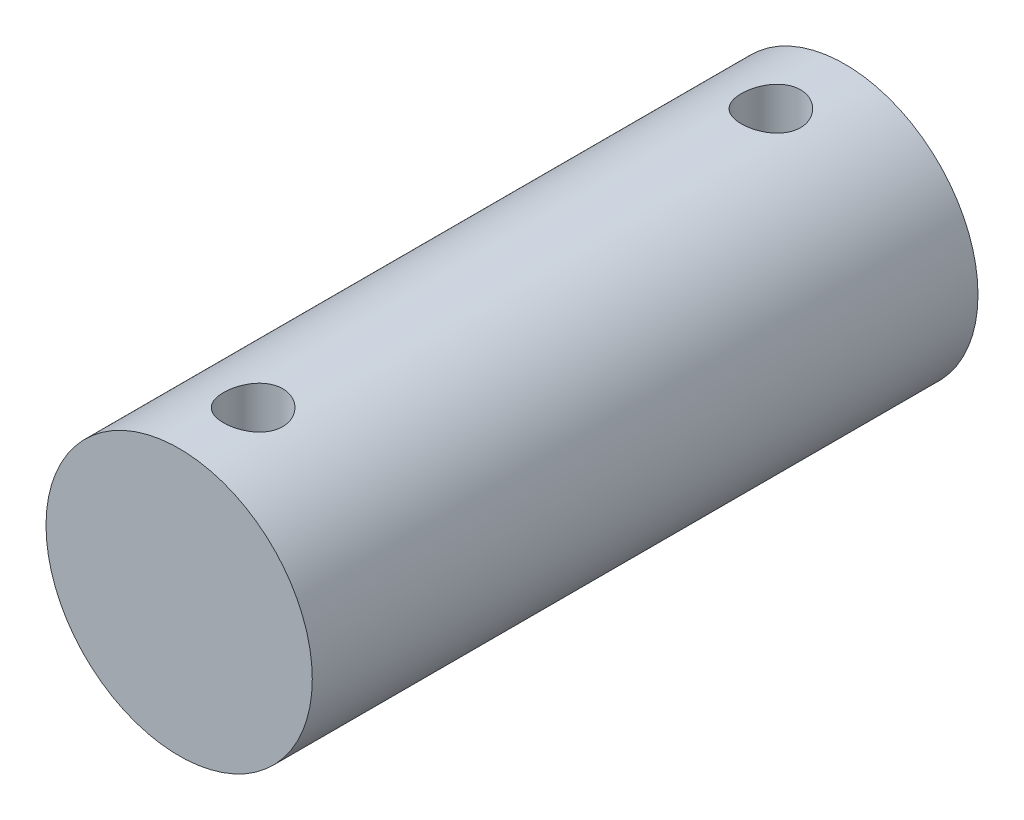
ISO-10303-21;
HEADER;
FILE_DESCRIPTION(('STEP AP214'),'2;1');
FILE_NAME('part.step','',(''),(''),'','','');
FILE_SCHEMA(('AUTOMOTIVE_DESIGN { 1 0 10303 214 1 1 1 1 }'));
ENDSEC;
DATA;
#1=APPLICATION_CONTEXT('core data for automotive mechanical design processes');
#2=APPLICATION_PROTOCOL_DEFINITION('international standard','automotive_design',2000,#1);
#3=PRODUCT_CONTEXT('',#1,'mechanical');
#4=PRODUCT('Part','Part','',(#3));
#5=PRODUCT_RELATED_PRODUCT_CATEGORY('part','',(#4));
#6=PRODUCT_DEFINITION_FORMATION('','',#4);
#7=PRODUCT_DEFINITION_CONTEXT('part definition',#1,'design');
#8=PRODUCT_DEFINITION('design','',#6,#7);
#9=PRODUCT_DEFINITION_SHAPE('','',#8);
#10=(LENGTH_UNIT() NAMED_UNIT(*) SI_UNIT(.MILLI.,.METRE.));
#11=(NAMED_UNIT(*) PLANE_ANGLE_UNIT() SI_UNIT($,.RADIAN.));
#12=(NAMED_UNIT(*) SI_UNIT($,.STERADIAN.) SOLID_ANGLE_UNIT());
#13=UNCERTAINTY_MEASURE_WITH_UNIT(LENGTH_MEASURE(1.E-05),#10,'distance_accuracy_value','');
#14=(GEOMETRIC_REPRESENTATION_CONTEXT(3) GLOBAL_UNCERTAINTY_ASSIGNED_CONTEXT((#13)) GLOBAL_UNIT_ASSIGNED_CONTEXT((#10,
#11,#12)) REPRESENTATION_CONTEXT('',''));
#15=CARTESIAN_POINT('',(0.,0.,0.));
#16=DIRECTION('',(0.,0.,1.));
#17=DIRECTION('',(1.,0.,0.));
#18=AXIS2_PLACEMENT_3D('',#15,#16,#17);
#19=CARTESIAN_POINT('',(0.,0.,12.5));
#20=DIRECTION('',(0.,0.,-1.));
#21=DIRECTION('',(-1.,0.,0.));
#22=AXIS2_PLACEMENT_3D('',#19,#20,#21);
#23=CYLINDRICAL_SURFACE('',#22,9.);
#24=CARTESIAN_POINT('',(0.,-9.,19.5));
#25=CARTESIAN_POINT('',(0.110880476775648,-8.99999796218252,19.4999962763202));
#26=CARTESIAN_POINT('',(0.22180556526962,-8.99793013995692,19.4907480183365));
#27=CARTESIAN_POINT('',(0.440501944103134,-8.9898809775767,19.4540395276494));
#28=CARTESIAN_POINT('',(0.548270975138988,-8.98389690217348,19.4265665659907));
#29=CARTESIAN_POINT('',(0.757463277761529,-8.96868113169008,19.3543140295083));
#30=CARTESIAN_POINT('',(0.858893152100285,-8.95945288439083,19.3095528230021));
#31=CARTESIAN_POINT('',(1.05280018031376,-8.93874335441378,19.2040533875276));
#32=CARTESIAN_POINT('',(1.14527750793335,-8.92726211547358,19.1433154687094));
#33=CARTESIAN_POINT('',(1.32018631401403,-8.9030909417421,19.0065243348933));
#34=CARTESIAN_POINT('',(1.40244861204354,-8.89038561641427,18.9302574978649));
#35=CARTESIAN_POINT('',(1.55312491045837,-8.86530601079787,18.7650319399069));
#36=CARTESIAN_POINT('',(1.62153764410855,-8.85293176088049,18.6760720592895));
#37=CARTESIAN_POINT('',(1.74332443410351,-8.82976328261711,18.4867281559417));
#38=CARTESIAN_POINT('',(1.79651742104404,-8.81898875742981,18.3862250419585));
#39=CARTESIAN_POINT('',(1.88519298954508,-8.80046096352395,18.1774272383076));
#40=CARTESIAN_POINT('',(1.92067776220096,-8.79270732104771,18.0691335144957));
#41=CARTESIAN_POINT('',(1.97236858006404,-8.78125609459189,17.8496665226773));
#42=CARTESIAN_POINT('',(1.98887467038069,-8.77749545807783,17.7385672848946));
#43=CARTESIAN_POINT('',(2.00307270997673,-8.77426673730669,17.5151177822138));
#44=CARTESIAN_POINT('',(2.00076704911663,-8.77479810778939,17.4027676780379));
#45=CARTESIAN_POINT('',(1.97764827517302,-8.78003632148146,17.1822433728062));
#46=CARTESIAN_POINT('',(1.95718464460217,-8.78466431384841,17.0740303758606));
#47=CARTESIAN_POINT('',(1.89888490681146,-8.79744954191676,16.862612856675));
#48=CARTESIAN_POINT('',(1.86104779681652,-8.80560698133176,16.7594086239146));
#49=CARTESIAN_POINT('',(1.76875672872875,-8.82460909970296,16.5599605616181));
#50=CARTESIAN_POINT('',(1.71416919379353,-8.8354752436249,16.4637806726639));
#51=CARTESIAN_POINT('',(1.59002068139849,-8.85865737910744,16.2818171294841));
#52=CARTESIAN_POINT('',(1.52045760074274,-8.87097357420597,16.1960349381798));
#53=CARTESIAN_POINT('',(1.36648683702983,-8.89600574612666,16.0352906906515));
#54=CARTESIAN_POINT('',(1.28178220526623,-8.90872450687872,15.9606132148949));
#55=CARTESIAN_POINT('',(1.10090661809162,-8.93287839122317,15.8264762710929));
#56=CARTESIAN_POINT('',(1.00473544183737,-8.94431349008427,15.7670170962181));
#57=CARTESIAN_POINT('',(0.803303190734736,-8.96465064233607,15.6649307242232));
#58=CARTESIAN_POINT('',(0.698022122319855,-8.97354693007659,15.6223417556917));
#59=CARTESIAN_POINT('',(0.481555930981457,-8.98776136366255,15.5555389869421));
#60=CARTESIAN_POINT('',(0.370371697593366,-8.99308004696785,15.5313224265859));
#61=CARTESIAN_POINT('',(0.147695483280845,-8.99946317761673,15.5023679867448));
#62=CARTESIAN_POINT('',(0.0362563973189052,-9.0006124862229,15.4972414998383));
#63=CARTESIAN_POINT('',(-0.18588592392808,-8.99876558650597,15.5055581042604));
#64=CARTESIAN_POINT('',(-0.296589210270646,-8.9957696689046,15.5189998933194));
#65=CARTESIAN_POINT('',(-0.512823257329422,-8.98602258758613,15.5637494151681));
#66=CARTESIAN_POINT('',(-0.618398491715484,-8.97931447007761,15.5948524562234));
#67=CARTESIAN_POINT('',(-0.822832805855832,-8.96289421086795,15.6738136874451));
#68=CARTESIAN_POINT('',(-0.921691300010178,-8.95318180764659,15.721673336306));
#69=CARTESIAN_POINT('',(-1.11148643989438,-8.9316215322764,15.833592876799));
#70=CARTESIAN_POINT('',(-1.20228573083225,-8.91974444590247,15.8978799430062));
#71=CARTESIAN_POINT('',(-1.37194696498812,-8.8952303234908,16.0405312491014));
#72=CARTESIAN_POINT('',(-1.45080730173413,-8.88259318550175,16.1188973803321));
#73=CARTESIAN_POINT('',(-1.59589548190985,-8.8576887894581,16.2892680335807));
#74=CARTESIAN_POINT('',(-1.66185381940073,-8.84543317664284,16.3815040900066));
#75=CARTESIAN_POINT('',(-1.77734611922752,-8.82295395378309,16.5759720344108));
#76=CARTESIAN_POINT('',(-1.82688079926974,-8.8127302549527,16.6782034853421));
#77=CARTESIAN_POINT('',(-1.90778001896259,-8.79557200548926,16.8892082891051));
#78=CARTESIAN_POINT('',(-1.93924786354759,-8.78861879659786,16.9979404422688));
#79=CARTESIAN_POINT('',(-1.98342027658406,-8.77875649697392,17.2193241848625));
#80=CARTESIAN_POINT('',(-1.99612795718356,-8.77584673547331,17.331975121026));
#81=CARTESIAN_POINT('',(-2.00228356641044,-8.77444401448977,17.5552788782783));
#82=CARTESIAN_POINT('',(-1.99615913143933,-8.77585298370124,17.6659195080601));
#83=CARTESIAN_POINT('',(-1.96578277121688,-8.78270664957547,17.8845497099668));
#84=CARTESIAN_POINT('',(-1.9415310740024,-8.78815129547033,17.9925393154235));
#85=CARTESIAN_POINT('',(-1.87579819980744,-8.80241428131525,18.2024491202274));
#86=CARTESIAN_POINT('',(-1.83438116628454,-8.81122005182769,18.3043903168816));
#87=CARTESIAN_POINT('',(-1.73554770348342,-8.83121764469058,18.4999399925467));
#88=CARTESIAN_POINT('',(-1.67812954585193,-8.84240972476633,18.593547569964));
#89=CARTESIAN_POINT('',(-1.54751358990558,-8.8662104283533,18.771876608948));
#90=CARTESIAN_POINT('',(-1.47401185511038,-8.8788437136774,18.8563722049227));
#91=CARTESIAN_POINT('',(-1.31392870594504,-8.90393974173387,19.0119700739313));
#92=CARTESIAN_POINT('',(-1.22734426623343,-8.91640244429053,19.0830692405084));
#93=CARTESIAN_POINT('',(-1.04214597064557,-8.93995259726581,19.2107759829199));
#94=CARTESIAN_POINT('',(-0.943385636634949,-8.95101923499229,19.2671751997349));
#95=CARTESIAN_POINT('',(-0.737560279778818,-8.97032058369249,19.3624833041812));
#96=CARTESIAN_POINT('',(-0.630502203312995,-8.97855763270815,19.4014066400462));
#97=CARTESIAN_POINT('',(-0.436138247729409,-8.98982812909554,19.4538413502768));
#98=CARTESIAN_POINT('',(-0.349871991901682,-8.9936186902321,19.4711173736663));
#99=CARTESIAN_POINT('',(-0.175746449894528,-8.99870537459789,19.4941979043062));
#100=CARTESIAN_POINT('',(-0.0878872388928783,-9.00000161523613,19.5000029515019));
#101=CARTESIAN_POINT('',(0.,-9.,19.5));
#102=B_SPLINE_CURVE_WITH_KNOTS('',3,(#24,#25,#26,#27,#28,#29,#30,#31,#32,#33,#34,#35,#36,#37,
#38,#39,#40,#41,#42,#43,#44,#45,#46,#47,#48,#49,#50,#51,#52,#53,#54,#55,#56,#57,#58,#59,#60,#61,
#62,#63,#64,#65,#66,#67,#68,#69,#70,#71,#72,#73,#74,#75,#76,#77,#78,#79,#80,#81,#82,#83,#84,#85,
#86,#87,#88,#89,#90,#91,#92,#93,#94,#95,#96,#97,#98,#99,#100,#101),.UNSPECIFIED.,.T.,.F.,(4,2,2,
2,2,2,2,2,2,2,2,2,2,2,2,2,2,2,2,2,2,2,2,2,2,2,2,2,2,2,2,2,2,2,2,2,2,2,4),(0.,0.332319689729797,
0.664871731249284,0.997071412407461,1.32926464516989,1.66638072002079,2.00352761490514,
2.34453296297976,2.6854961068774,3.02099125638107,3.35644378496591,3.68557668145784,
4.0147285774694,4.34657669709582,4.67847145258301,5.01778179808977,5.35709867969828,
5.69718012811238,6.03721047501988,6.37027992124269,6.70332600912267,7.03258869425167,
7.36188004945459,7.69599803262042,8.03016093387757,8.37069473105728,8.71121364510411,
9.04976559055243,9.38826136686411,9.71912785142417,10.0499901738286,10.3796271201578,
10.7092996858639,11.0458432631283,11.3824647846641,11.7236258704957,12.0645043787094,
12.3279234735856,12.5913301688795),.UNSPECIFIED.);
#103=CARTESIAN_POINT('',(0.,-9.,19.5));
#104=VERTEX_POINT('',#103);
#105=EDGE_CURVE('E10',#104,#104,#102,.T.);
#106=ORIENTED_EDGE('',*,*,#105,.T.);
#107=EDGE_LOOP('',(#106));
#108=FACE_BOUND('',#107,.T.);
#109=CARTESIAN_POINT('',(0.,9.,19.5));
#110=CARTESIAN_POINT('',(-0.110880476775648,8.99999796218252,19.4999962763202));
#111=CARTESIAN_POINT('',(-0.22180556526962,8.99793013995692,19.4907480183365));
#112=CARTESIAN_POINT('',(-0.440501944103134,8.9898809775767,19.4540395276494));
#113=CARTESIAN_POINT('',(-0.548270975138988,8.98389690217348,19.4265665659907));
#114=CARTESIAN_POINT('',(-0.757463277761529,8.96868113169008,19.3543140295083));
#115=CARTESIAN_POINT('',(-0.858893152100285,8.95945288439083,19.3095528230021));
#116=CARTESIAN_POINT('',(-1.05280018031376,8.93874335441378,19.2040533875276));
#117=CARTESIAN_POINT('',(-1.14527750793335,8.92726211547358,19.1433154687094));
#118=CARTESIAN_POINT('',(-1.32018631401403,8.9030909417421,19.0065243348933));
#119=CARTESIAN_POINT('',(-1.40244861204354,8.89038561641427,18.9302574978649));
#120=CARTESIAN_POINT('',(-1.55312491045837,8.86530601079787,18.7650319399069));
#121=CARTESIAN_POINT('',(-1.62153764410855,8.85293176088049,18.6760720592895));
#122=CARTESIAN_POINT('',(-1.74332443410351,8.82976328261711,18.4867281559417));
#123=CARTESIAN_POINT('',(-1.79651742104404,8.81898875742981,18.3862250419585));
#124=CARTESIAN_POINT('',(-1.88519298954508,8.80046096352395,18.1774272383076));
#125=CARTESIAN_POINT('',(-1.92067776220096,8.79270732104771,18.0691335144957));
#126=CARTESIAN_POINT('',(-1.97236858006404,8.78125609459189,17.8496665226773));
#127=CARTESIAN_POINT('',(-1.98887467038069,8.77749545807783,17.7385672848946));
#128=CARTESIAN_POINT('',(-2.00307270997673,8.77426673730669,17.5151177822138));
#129=CARTESIAN_POINT('',(-2.00076704911663,8.77479810778939,17.4027676780379));
#130=CARTESIAN_POINT('',(-1.97764827517302,8.78003632148146,17.1822433728062));
#131=CARTESIAN_POINT('',(-1.95718464460217,8.78466431384841,17.0740303758606));
#132=CARTESIAN_POINT('',(-1.89888490681146,8.79744954191676,16.862612856675));
#133=CARTESIAN_POINT('',(-1.86104779681652,8.80560698133176,16.7594086239146));
#134=CARTESIAN_POINT('',(-1.76875672872875,8.82460909970296,16.5599605616181));
#135=CARTESIAN_POINT('',(-1.71416919379353,8.8354752436249,16.4637806726639));
#136=CARTESIAN_POINT('',(-1.59002068139849,8.85865737910744,16.2818171294841));
#137=CARTESIAN_POINT('',(-1.52045760074274,8.87097357420597,16.1960349381798));
#138=CARTESIAN_POINT('',(-1.36648683702983,8.89600574612666,16.0352906906515));
#139=CARTESIAN_POINT('',(-1.28178220526623,8.90872450687872,15.9606132148949));
#140=CARTESIAN_POINT('',(-1.10090661809162,8.93287839122317,15.8264762710929));
#141=CARTESIAN_POINT('',(-1.00473544183737,8.94431349008427,15.7670170962181));
#142=CARTESIAN_POINT('',(-0.803303190734736,8.96465064233607,15.6649307242232));
#143=CARTESIAN_POINT('',(-0.698022122319855,8.97354693007659,15.6223417556917));
#144=CARTESIAN_POINT('',(-0.481555930981457,8.98776136366255,15.5555389869421));
#145=CARTESIAN_POINT('',(-0.370371697593366,8.99308004696785,15.5313224265859));
#146=CARTESIAN_POINT('',(-0.147695483280845,8.99946317761673,15.5023679867448));
#147=CARTESIAN_POINT('',(-0.0362563973189052,9.0006124862229,15.4972414998383));
#148=CARTESIAN_POINT('',(0.18588592392808,8.99876558650597,15.5055581042604));
#149=CARTESIAN_POINT('',(0.296589210270646,8.9957696689046,15.5189998933194));
#150=CARTESIAN_POINT('',(0.512823257329422,8.98602258758613,15.5637494151681));
#151=CARTESIAN_POINT('',(0.618398491715484,8.97931447007761,15.5948524562234));
#152=CARTESIAN_POINT('',(0.822832805855832,8.96289421086795,15.6738136874451));
#153=CARTESIAN_POINT('',(0.921691300010178,8.95318180764659,15.721673336306));
#154=CARTESIAN_POINT('',(1.11148643989438,8.9316215322764,15.833592876799));
#155=CARTESIAN_POINT('',(1.20228573083225,8.91974444590247,15.8978799430062));
#156=CARTESIAN_POINT('',(1.37194696498812,8.8952303234908,16.0405312491014));
#157=CARTESIAN_POINT('',(1.45080730173413,8.88259318550175,16.1188973803321));
#158=CARTESIAN_POINT('',(1.59589548190985,8.8576887894581,16.2892680335807));
#159=CARTESIAN_POINT('',(1.66185381940073,8.84543317664284,16.3815040900066));
#160=CARTESIAN_POINT('',(1.77734611922752,8.82295395378309,16.5759720344108));
#161=CARTESIAN_POINT('',(1.82688079926974,8.8127302549527,16.6782034853421));
#162=CARTESIAN_POINT('',(1.90778001896259,8.79557200548926,16.8892082891051));
#163=CARTESIAN_POINT('',(1.93924786354759,8.78861879659786,16.9979404422688));
#164=CARTESIAN_POINT('',(1.98342027658406,8.77875649697392,17.2193241848625));
#165=CARTESIAN_POINT('',(1.99612795718356,8.77584673547331,17.331975121026));
#166=CARTESIAN_POINT('',(2.00228356641044,8.77444401448977,17.5552788782783));
#167=CARTESIAN_POINT('',(1.99615913143933,8.77585298370124,17.6659195080601));
#168=CARTESIAN_POINT('',(1.96578277121688,8.78270664957547,17.8845497099668));
#169=CARTESIAN_POINT('',(1.9415310740024,8.78815129547033,17.9925393154235));
#170=CARTESIAN_POINT('',(1.87579819980744,8.80241428131525,18.2024491202274));
#171=CARTESIAN_POINT('',(1.83438116628454,8.81122005182769,18.3043903168816));
#172=CARTESIAN_POINT('',(1.73554770348342,8.83121764469058,18.4999399925467));
#173=CARTESIAN_POINT('',(1.67812954585193,8.84240972476633,18.593547569964));
#174=CARTESIAN_POINT('',(1.54751358990558,8.8662104283533,18.771876608948));
#175=CARTESIAN_POINT('',(1.47401185511038,8.8788437136774,18.8563722049227));
#176=CARTESIAN_POINT('',(1.31392870594504,8.90393974173387,19.0119700739313));
#177=CARTESIAN_POINT('',(1.22734426623343,8.91640244429053,19.0830692405084));
#178=CARTESIAN_POINT('',(1.04214597064557,8.93995259726581,19.2107759829199));
#179=CARTESIAN_POINT('',(0.943385636634949,8.95101923499229,19.2671751997349));
#180=CARTESIAN_POINT('',(0.737560279778818,8.97032058369249,19.3624833041812));
#181=CARTESIAN_POINT('',(0.630502203312995,8.97855763270815,19.4014066400462));
#182=CARTESIAN_POINT('',(0.436138247729409,8.98982812909554,19.4538413502768));
#183=CARTESIAN_POINT('',(0.349871991901682,8.9936186902321,19.4711173736663));
#184=CARTESIAN_POINT('',(0.175746449894528,8.99870537459789,19.4941979043062));
#185=CARTESIAN_POINT('',(0.0878872388928783,9.00000161523613,19.5000029515019));
#186=CARTESIAN_POINT('',(0.,9.,19.5));
#187=B_SPLINE_CURVE_WITH_KNOTS('',3,(#109,#110,#111,#112,#113,#114,#115,#116,#117,#118,#119,
#120,#121,#122,#123,#124,#125,#126,#127,#128,#129,#130,#131,#132,#133,#134,#135,#136,#137,#138,
#139,#140,#141,#142,#143,#144,#145,#146,#147,#148,#149,#150,#151,#152,#153,#154,#155,#156,#157,
#158,#159,#160,#161,#162,#163,#164,#165,#166,#167,#168,#169,#170,#171,#172,#173,#174,#175,#176,
#177,#178,#179,#180,#181,#182,#183,#184,#185,#186),.UNSPECIFIED.,.T.,.F.,(4,2,2,2,2,2,2,2,2,2,2,
2,2,2,2,2,2,2,2,2,2,2,2,2,2,2,2,2,2,2,2,2,2,2,2,2,2,2,4),(0.,0.332319689729797,
0.664871731249284,0.997071412407461,1.32926464516989,1.66638072002079,2.00352761490514,
2.34453296297976,2.6854961068774,3.02099125638107,3.35644378496591,3.68557668145784,
4.0147285774694,4.34657669709582,4.67847145258301,5.01778179808977,5.35709867969828,
5.69718012811238,6.03721047501988,6.37027992124269,6.70332600912267,7.03258869425167,
7.36188004945459,7.69599803262042,8.03016093387757,8.37069473105728,8.71121364510411,
9.04976559055243,9.38826136686411,9.71912785142417,10.0499901738286,10.3796271201578,
10.7092996858639,11.0458432631283,11.3824647846641,11.7236258704957,12.0645043787094,
12.3279234735856,12.5913301688795),.UNSPECIFIED.);
#188=CARTESIAN_POINT('',(0.,9.,19.5));
#189=VERTEX_POINT('',#188);
#190=EDGE_CURVE('E48',#189,#189,#187,.T.);
#191=ORIENTED_EDGE('',*,*,#190,.T.);
#192=EDGE_LOOP('',(#191));
#193=FACE_BOUND('',#192,.T.);
#194=CARTESIAN_POINT('',(0.,0.,22.5));
#195=DIRECTION('',(0.,0.,1.));
#196=DIRECTION('',(1.,0.,0.));
#197=AXIS2_PLACEMENT_3D('',#194,#195,#196);
#198=CIRCLE('',#197,9.);
#199=CARTESIAN_POINT('',(9.,0.,22.5));
#200=VERTEX_POINT('',#199);
#201=EDGE_CURVE('E52',#200,#200,#198,.T.);
#202=ORIENTED_EDGE('',*,*,#201,.F.);
#203=EDGE_LOOP('',(#202));
#204=FACE_BOUND('',#203,.T.);
#205=CARTESIAN_POINT('',(0.,-9.,-19.5));
#206=CARTESIAN_POINT('',(0.110880476775648,-8.99999796218252,-19.4999962763202));
#207=CARTESIAN_POINT('',(0.22180556526962,-8.99793013995692,-19.4907480183365));
#208=CARTESIAN_POINT('',(0.440501944103134,-8.9898809775767,-19.4540395276494));
#209=CARTESIAN_POINT('',(0.548270975138988,-8.98389690217348,-19.4265665659907));
#210=CARTESIAN_POINT('',(0.757463277761529,-8.96868113169008,-19.3543140295083));
#211=CARTESIAN_POINT('',(0.858893152100285,-8.95945288439083,-19.3095528230021));
#212=CARTESIAN_POINT('',(1.05280018031376,-8.93874335441378,-19.2040533875276));
#213=CARTESIAN_POINT('',(1.14527750793335,-8.92726211547358,-19.1433154687094));
#214=CARTESIAN_POINT('',(1.32018631401403,-8.9030909417421,-19.0065243348933));
#215=CARTESIAN_POINT('',(1.40244861204354,-8.89038561641427,-18.9302574978649));
#216=CARTESIAN_POINT('',(1.55312491045837,-8.86530601079787,-18.7650319399069));
#217=CARTESIAN_POINT('',(1.62153764410855,-8.85293176088049,-18.6760720592895));
#218=CARTESIAN_POINT('',(1.74332443410351,-8.82976328261711,-18.4867281559417));
#219=CARTESIAN_POINT('',(1.79651742104404,-8.81898875742981,-18.3862250419585));
#220=CARTESIAN_POINT('',(1.88519298954508,-8.80046096352395,-18.1774272383076));
#221=CARTESIAN_POINT('',(1.92067776220096,-8.79270732104771,-18.0691335144957));
#222=CARTESIAN_POINT('',(1.97236858006404,-8.78125609459189,-17.8496665226773));
#223=CARTESIAN_POINT('',(1.98887467038069,-8.77749545807783,-17.7385672848946));
#224=CARTESIAN_POINT('',(2.00307270997673,-8.77426673730669,-17.5151177822138));
#225=CARTESIAN_POINT('',(2.00076704911663,-8.77479810778939,-17.4027676780379));
#226=CARTESIAN_POINT('',(1.97764827517302,-8.78003632148146,-17.1822433728062));
#227=CARTESIAN_POINT('',(1.95718464460217,-8.78466431384841,-17.0740303758606));
#228=CARTESIAN_POINT('',(1.89888490681146,-8.79744954191676,-16.862612856675));
#229=CARTESIAN_POINT('',(1.86104779681652,-8.80560698133176,-16.7594086239146));
#230=CARTESIAN_POINT('',(1.76875672872875,-8.82460909970296,-16.5599605616181));
#231=CARTESIAN_POINT('',(1.71416919379353,-8.8354752436249,-16.4637806726639));
#232=CARTESIAN_POINT('',(1.59002068139849,-8.85865737910744,-16.2818171294841));
#233=CARTESIAN_POINT('',(1.52045760074274,-8.87097357420597,-16.1960349381798));
#234=CARTESIAN_POINT('',(1.36648683702983,-8.89600574612666,-16.0352906906515));
#235=CARTESIAN_POINT('',(1.28178220526623,-8.90872450687872,-15.9606132148949));
#236=CARTESIAN_POINT('',(1.10090661809162,-8.93287839122317,-15.8264762710929));
#237=CARTESIAN_POINT('',(1.00473544183737,-8.94431349008427,-15.7670170962181));
#238=CARTESIAN_POINT('',(0.803303190734736,-8.96465064233607,-15.6649307242232));
#239=CARTESIAN_POINT('',(0.698022122319855,-8.97354693007659,-15.6223417556917));
#240=CARTESIAN_POINT('',(0.481555930981457,-8.98776136366255,-15.5555389869421));
#241=CARTESIAN_POINT('',(0.370371697593366,-8.99308004696785,-15.5313224265859));
#242=CARTESIAN_POINT('',(0.147695483280845,-8.99946317761673,-15.5023679867448));
#243=CARTESIAN_POINT('',(0.0362563973189052,-9.0006124862229,-15.4972414998383));
#244=CARTESIAN_POINT('',(-0.18588592392808,-8.99876558650597,-15.5055581042604));
#245=CARTESIAN_POINT('',(-0.296589210270646,-8.9957696689046,-15.5189998933194));
#246=CARTESIAN_POINT('',(-0.512823257329422,-8.98602258758613,-15.5637494151681));
#247=CARTESIAN_POINT('',(-0.618398491715484,-8.97931447007761,-15.5948524562234));
#248=CARTESIAN_POINT('',(-0.822832805855832,-8.96289421086795,-15.6738136874451));
#249=CARTESIAN_POINT('',(-0.921691300010178,-8.95318180764659,-15.721673336306));
#250=CARTESIAN_POINT('',(-1.11148643989438,-8.9316215322764,-15.833592876799));
#251=CARTESIAN_POINT('',(-1.20228573083225,-8.91974444590247,-15.8978799430062));
#252=CARTESIAN_POINT('',(-1.37194696498812,-8.8952303234908,-16.0405312491014));
#253=CARTESIAN_POINT('',(-1.45080730173413,-8.88259318550175,-16.1188973803321));
#254=CARTESIAN_POINT('',(-1.59589548190985,-8.8576887894581,-16.2892680335807));
#255=CARTESIAN_POINT('',(-1.66185381940073,-8.84543317664284,-16.3815040900066));
#256=CARTESIAN_POINT('',(-1.77734611922752,-8.82295395378309,-16.5759720344108));
#257=CARTESIAN_POINT('',(-1.82688079926974,-8.8127302549527,-16.6782034853421));
#258=CARTESIAN_POINT('',(-1.90778001896259,-8.79557200548926,-16.8892082891051));
#259=CARTESIAN_POINT('',(-1.93924786354759,-8.78861879659786,-16.9979404422688));
#260=CARTESIAN_POINT('',(-1.98342027658406,-8.77875649697392,-17.2193241848625));
#261=CARTESIAN_POINT('',(-1.99612795718356,-8.77584673547331,-17.331975121026));
#262=CARTESIAN_POINT('',(-2.00228356641044,-8.77444401448977,-17.5552788782783));
#263=CARTESIAN_POINT('',(-1.99615913143933,-8.77585298370124,-17.6659195080601));
#264=CARTESIAN_POINT('',(-1.96578277121688,-8.78270664957547,-17.8845497099668));
#265=CARTESIAN_POINT('',(-1.9415310740024,-8.78815129547033,-17.9925393154235));
#266=CARTESIAN_POINT('',(-1.87579819980744,-8.80241428131525,-18.2024491202274));
#267=CARTESIAN_POINT('',(-1.83438116628454,-8.81122005182769,-18.3043903168816));
#268=CARTESIAN_POINT('',(-1.73554770348342,-8.83121764469058,-18.4999399925467));
#269=CARTESIAN_POINT('',(-1.67812954585193,-8.84240972476633,-18.593547569964));
#270=CARTESIAN_POINT('',(-1.54751358990558,-8.8662104283533,-18.771876608948));
#271=CARTESIAN_POINT('',(-1.47401185511038,-8.8788437136774,-18.8563722049227));
#272=CARTESIAN_POINT('',(-1.31392870594504,-8.90393974173387,-19.0119700739313));
#273=CARTESIAN_POINT('',(-1.22734426623343,-8.91640244429053,-19.0830692405084));
#274=CARTESIAN_POINT('',(-1.04214597064557,-8.93995259726581,-19.2107759829199));
#275=CARTESIAN_POINT('',(-0.943385636634949,-8.95101923499229,-19.2671751997349));
#276=CARTESIAN_POINT('',(-0.737560279778818,-8.97032058369249,-19.3624833041812));
#277=CARTESIAN_POINT('',(-0.630502203312995,-8.97855763270815,-19.4014066400462));
#278=CARTESIAN_POINT('',(-0.436138247729409,-8.98982812909554,-19.4538413502768));
#279=CARTESIAN_POINT('',(-0.349871991901682,-8.9936186902321,-19.4711173736663));
#280=CARTESIAN_POINT('',(-0.175746449894528,-8.99870537459789,-19.4941979043062));
#281=CARTESIAN_POINT('',(-0.0878872388928783,-9.00000161523613,-19.5000029515019));
#282=CARTESIAN_POINT('',(0.,-9.,-19.5));
#283=B_SPLINE_CURVE_WITH_KNOTS('',3,(#205,#206,#207,#208,#209,#210,#211,#212,#213,#214,#215,
#216,#217,#218,#219,#220,#221,#222,#223,#224,#225,#226,#227,#228,#229,#230,#231,#232,#233,#234,
#235,#236,#237,#238,#239,#240,#241,#242,#243,#244,#245,#246,#247,#248,#249,#250,#251,#252,#253,
#254,#255,#256,#257,#258,#259,#260,#261,#262,#263,#264,#265,#266,#267,#268,#269,#270,#271,#272,
#273,#274,#275,#276,#277,#278,#279,#280,#281,#282),.UNSPECIFIED.,.T.,.F.,(4,2,2,2,2,2,2,2,2,2,2,
2,2,2,2,2,2,2,2,2,2,2,2,2,2,2,2,2,2,2,2,2,2,2,2,2,2,2,4),(0.,0.332319689729797,
0.664871731249284,0.997071412407461,1.32926464516989,1.66638072002079,2.00352761490514,
2.34453296297976,2.6854961068774,3.02099125638107,3.35644378496591,3.68557668145784,
4.0147285774694,4.34657669709582,4.67847145258301,5.01778179808977,5.35709867969828,
5.69718012811238,6.03721047501988,6.37027992124269,6.70332600912267,7.03258869425167,
7.36188004945459,7.69599803262042,8.03016093387757,8.37069473105728,8.71121364510411,
9.04976559055243,9.38826136686411,9.71912785142417,10.0499901738286,10.3796271201578,
10.7092996858639,11.0458432631283,11.3824647846641,11.7236258704957,12.0645043787094,
12.3279234735856,12.5913301688795),.UNSPECIFIED.);
#284=CARTESIAN_POINT('',(0.,-9.,-19.5));
#285=VERTEX_POINT('',#284);
#286=EDGE_CURVE('E56',#285,#285,#283,.T.);
#287=ORIENTED_EDGE('',*,*,#286,.F.);
#288=EDGE_LOOP('',(#287));
#289=FACE_BOUND('',#288,.T.);
#290=CARTESIAN_POINT('',(0.,9.,-19.5));
#291=CARTESIAN_POINT('',(-0.110880476775648,8.99999796218252,-19.4999962763202));
#292=CARTESIAN_POINT('',(-0.22180556526962,8.99793013995692,-19.4907480183365));
#293=CARTESIAN_POINT('',(-0.440501944103134,8.9898809775767,-19.4540395276494));
#294=CARTESIAN_POINT('',(-0.548270975138988,8.98389690217348,-19.4265665659907));
#295=CARTESIAN_POINT('',(-0.757463277761529,8.96868113169008,-19.3543140295083));
#296=CARTESIAN_POINT('',(-0.858893152100285,8.95945288439083,-19.3095528230021));
#297=CARTESIAN_POINT('',(-1.05280018031376,8.93874335441378,-19.2040533875276));
#298=CARTESIAN_POINT('',(-1.14527750793335,8.92726211547358,-19.1433154687094));
#299=CARTESIAN_POINT('',(-1.32018631401403,8.9030909417421,-19.0065243348933));
#300=CARTESIAN_POINT('',(-1.40244861204354,8.89038561641427,-18.9302574978649));
#301=CARTESIAN_POINT('',(-1.55312491045837,8.86530601079787,-18.7650319399069));
#302=CARTESIAN_POINT('',(-1.62153764410855,8.85293176088049,-18.6760720592895));
#303=CARTESIAN_POINT('',(-1.74332443410351,8.82976328261711,-18.4867281559417));
#304=CARTESIAN_POINT('',(-1.79651742104404,8.81898875742981,-18.3862250419585));
#305=CARTESIAN_POINT('',(-1.88519298954508,8.80046096352395,-18.1774272383076));
#306=CARTESIAN_POINT('',(-1.92067776220096,8.79270732104771,-18.0691335144957));
#307=CARTESIAN_POINT('',(-1.97236858006404,8.78125609459189,-17.8496665226773));
#308=CARTESIAN_POINT('',(-1.98887467038069,8.77749545807783,-17.7385672848946));
#309=CARTESIAN_POINT('',(-2.00307270997673,8.77426673730669,-17.5151177822138));
#310=CARTESIAN_POINT('',(-2.00076704911663,8.77479810778939,-17.4027676780379));
#311=CARTESIAN_POINT('',(-1.97764827517302,8.78003632148146,-17.1822433728062));
#312=CARTESIAN_POINT('',(-1.95718464460217,8.78466431384841,-17.0740303758606));
#313=CARTESIAN_POINT('',(-1.89888490681146,8.79744954191676,-16.862612856675));
#314=CARTESIAN_POINT('',(-1.86104779681652,8.80560698133176,-16.7594086239146));
#315=CARTESIAN_POINT('',(-1.76875672872875,8.82460909970296,-16.5599605616181));
#316=CARTESIAN_POINT('',(-1.71416919379353,8.8354752436249,-16.4637806726639));
#317=CARTESIAN_POINT('',(-1.59002068139849,8.85865737910744,-16.2818171294841));
#318=CARTESIAN_POINT('',(-1.52045760074274,8.87097357420597,-16.1960349381798));
#319=CARTESIAN_POINT('',(-1.36648683702983,8.89600574612666,-16.0352906906515));
#320=CARTESIAN_POINT('',(-1.28178220526623,8.90872450687872,-15.9606132148949));
#321=CARTESIAN_POINT('',(-1.10090661809162,8.93287839122317,-15.8264762710929));
#322=CARTESIAN_POINT('',(-1.00473544183737,8.94431349008427,-15.7670170962181));
#323=CARTESIAN_POINT('',(-0.803303190734736,8.96465064233607,-15.6649307242232));
#324=CARTESIAN_POINT('',(-0.698022122319855,8.97354693007659,-15.6223417556917));
#325=CARTESIAN_POINT('',(-0.481555930981457,8.98776136366255,-15.5555389869421));
#326=CARTESIAN_POINT('',(-0.370371697593366,8.99308004696785,-15.5313224265859));
#327=CARTESIAN_POINT('',(-0.147695483280845,8.99946317761673,-15.5023679867448));
#328=CARTESIAN_POINT('',(-0.0362563973189052,9.0006124862229,-15.4972414998383));
#329=CARTESIAN_POINT('',(0.18588592392808,8.99876558650597,-15.5055581042604));
#330=CARTESIAN_POINT('',(0.296589210270646,8.9957696689046,-15.5189998933194));
#331=CARTESIAN_POINT('',(0.512823257329422,8.98602258758613,-15.5637494151681));
#332=CARTESIAN_POINT('',(0.618398491715484,8.97931447007761,-15.5948524562234));
#333=CARTESIAN_POINT('',(0.822832805855832,8.96289421086795,-15.6738136874451));
#334=CARTESIAN_POINT('',(0.921691300010178,8.95318180764659,-15.721673336306));
#335=CARTESIAN_POINT('',(1.11148643989438,8.9316215322764,-15.833592876799));
#336=CARTESIAN_POINT('',(1.20228573083225,8.91974444590247,-15.8978799430062));
#337=CARTESIAN_POINT('',(1.37194696498812,8.8952303234908,-16.0405312491014));
#338=CARTESIAN_POINT('',(1.45080730173413,8.88259318550175,-16.1188973803321));
#339=CARTESIAN_POINT('',(1.59589548190985,8.8576887894581,-16.2892680335807));
#340=CARTESIAN_POINT('',(1.66185381940073,8.84543317664284,-16.3815040900066));
#341=CARTESIAN_POINT('',(1.77734611922752,8.82295395378309,-16.5759720344108));
#342=CARTESIAN_POINT('',(1.82688079926974,8.8127302549527,-16.6782034853421));
#343=CARTESIAN_POINT('',(1.90778001896259,8.79557200548926,-16.8892082891051));
#344=CARTESIAN_POINT('',(1.93924786354759,8.78861879659786,-16.9979404422688));
#345=CARTESIAN_POINT('',(1.98342027658406,8.77875649697392,-17.2193241848625));
#346=CARTESIAN_POINT('',(1.99612795718356,8.77584673547331,-17.331975121026));
#347=CARTESIAN_POINT('',(2.00228356641044,8.77444401448977,-17.5552788782783));
#348=CARTESIAN_POINT('',(1.99615913143933,8.77585298370124,-17.6659195080601));
#349=CARTESIAN_POINT('',(1.96578277121688,8.78270664957547,-17.8845497099668));
#350=CARTESIAN_POINT('',(1.9415310740024,8.78815129547033,-17.9925393154235));
#351=CARTESIAN_POINT('',(1.87579819980744,8.80241428131525,-18.2024491202274));
#352=CARTESIAN_POINT('',(1.83438116628454,8.81122005182769,-18.3043903168816));
#353=CARTESIAN_POINT('',(1.73554770348342,8.83121764469058,-18.4999399925467));
#354=CARTESIAN_POINT('',(1.67812954585193,8.84240972476633,-18.593547569964));
#355=CARTESIAN_POINT('',(1.54751358990558,8.8662104283533,-18.771876608948));
#356=CARTESIAN_POINT('',(1.47401185511038,8.8788437136774,-18.8563722049227));
#357=CARTESIAN_POINT('',(1.31392870594504,8.90393974173387,-19.0119700739313));
#358=CARTESIAN_POINT('',(1.22734426623343,8.91640244429053,-19.0830692405084));
#359=CARTESIAN_POINT('',(1.04214597064557,8.93995259726581,-19.2107759829199));
#360=CARTESIAN_POINT('',(0.943385636634949,8.95101923499229,-19.2671751997349));
#361=CARTESIAN_POINT('',(0.737560279778818,8.97032058369249,-19.3624833041812));
#362=CARTESIAN_POINT('',(0.630502203312995,8.97855763270815,-19.4014066400462));
#363=CARTESIAN_POINT('',(0.436138247729409,8.98982812909554,-19.4538413502768));
#364=CARTESIAN_POINT('',(0.349871991901682,8.9936186902321,-19.4711173736663));
#365=CARTESIAN_POINT('',(0.175746449894528,8.99870537459789,-19.4941979043062));
#366=CARTESIAN_POINT('',(0.0878872388928783,9.00000161523613,-19.5000029515019));
#367=CARTESIAN_POINT('',(0.,9.,-19.5));
#368=B_SPLINE_CURVE_WITH_KNOTS('',3,(#290,#291,#292,#293,#294,#295,#296,#297,#298,#299,#300,
#301,#302,#303,#304,#305,#306,#307,#308,#309,#310,#311,#312,#313,#314,#315,#316,#317,#318,#319,
#320,#321,#322,#323,#324,#325,#326,#327,#328,#329,#330,#331,#332,#333,#334,#335,#336,#337,#338,
#339,#340,#341,#342,#343,#344,#345,#346,#347,#348,#349,#350,#351,#352,#353,#354,#355,#356,#357,
#358,#359,#360,#361,#362,#363,#364,#365,#366,#367),.UNSPECIFIED.,.T.,.F.,(4,2,2,2,2,2,2,2,2,2,2,
2,2,2,2,2,2,2,2,2,2,2,2,2,2,2,2,2,2,2,2,2,2,2,2,2,2,2,4),(0.,0.332319689729797,
0.664871731249284,0.997071412407461,1.32926464516989,1.66638072002079,2.00352761490514,
2.34453296297976,2.6854961068774,3.02099125638107,3.35644378496591,3.68557668145784,
4.0147285774694,4.34657669709582,4.67847145258301,5.01778179808977,5.35709867969828,
5.69718012811238,6.03721047501988,6.37027992124269,6.70332600912267,7.03258869425167,
7.36188004945459,7.69599803262042,8.03016093387757,8.37069473105728,8.71121364510411,
9.04976559055243,9.38826136686411,9.71912785142417,10.0499901738286,10.3796271201578,
10.7092996858639,11.0458432631283,11.3824647846641,11.7236258704957,12.0645043787094,
12.3279234735856,12.5913301688795),.UNSPECIFIED.);
#369=CARTESIAN_POINT('',(0.,9.,-19.5));
#370=VERTEX_POINT('',#369);
#371=EDGE_CURVE('E87',#370,#370,#368,.T.);
#372=ORIENTED_EDGE('',*,*,#371,.F.);
#373=EDGE_LOOP('',(#372));
#374=FACE_BOUND('',#373,.T.);
#375=CARTESIAN_POINT('',(0.,0.,-22.5));
#376=DIRECTION('',(0.,0.,1.));
#377=DIRECTION('',(1.,0.,0.));
#378=AXIS2_PLACEMENT_3D('',#375,#376,#377);
#379=CIRCLE('',#378,9.);
#380=CARTESIAN_POINT('',(9.,0.,-22.5));
#381=VERTEX_POINT('',#380);
#382=EDGE_CURVE('E90',#381,#381,#379,.T.);
#383=ORIENTED_EDGE('',*,*,#382,.T.);
#384=EDGE_LOOP('',(#383));
#385=FACE_BOUND('',#384,.T.);
#386=ADVANCED_FACE('F37',(#108,#193,#204,#289,#374,#385),#23,.T.);
#387=CARTESIAN_POINT('',(0.,0.,22.5));
#388=DIRECTION('',(0.,0.,1.));
#389=DIRECTION('',(1.,0.,0.));
#390=AXIS2_PLACEMENT_3D('',#387,#388,#389);
#391=PLANE('',#390);
#392=ORIENTED_EDGE('',*,*,#201,.T.);
#393=EDGE_LOOP('',(#392));
#394=FACE_BOUND('',#393,.T.);
#395=ADVANCED_FACE('F67',(#394),#391,.T.);
#396=CARTESIAN_POINT('',(0.,-9.,17.5));
#397=DIRECTION('',(0.,1.,0.));
#398=DIRECTION('',(0.,0.,1.));
#399=AXIS2_PLACEMENT_3D('',#396,#397,#398);
#400=CYLINDRICAL_SURFACE('',#399,2.);
#401=ORIENTED_EDGE('',*,*,#190,.F.);
#402=EDGE_LOOP('',(#401));
#403=FACE_BOUND('',#402,.T.);
#404=ORIENTED_EDGE('',*,*,#105,.F.);
#405=EDGE_LOOP('',(#404));
#406=FACE_BOUND('',#405,.T.);
#407=ADVANCED_FACE('F62',(#403,#406),#400,.F.);
#408=CARTESIAN_POINT('',(0.,0.,-22.5));
#409=DIRECTION('',(0.,0.,-1.));
#410=DIRECTION('',(1.,0.,0.));
#411=AXIS2_PLACEMENT_3D('',#408,#409,#410);
#412=PLANE('',#411);
#413=ORIENTED_EDGE('',*,*,#382,.F.);
#414=EDGE_LOOP('',(#413));
#415=FACE_BOUND('',#414,.T.);
#416=ADVANCED_FACE('F66',(#415),#412,.T.);
#417=CARTESIAN_POINT('',(0.,-9.,-17.5));
#418=DIRECTION('',(0.,1.,0.));
#419=DIRECTION('',(0.,0.,-1.));
#420=AXIS2_PLACEMENT_3D('',#417,#418,#419);
#421=CYLINDRICAL_SURFACE('',#420,2.);
#422=ORIENTED_EDGE('',*,*,#371,.T.);
#423=EDGE_LOOP('',(#422));
#424=FACE_BOUND('',#423,.T.);
#425=ORIENTED_EDGE('',*,*,#286,.T.);
#426=EDGE_LOOP('',(#425));
#427=FACE_BOUND('',#426,.T.);
#428=ADVANCED_FACE('F101',(#424,#427),#421,.F.);
#429=CLOSED_SHELL('',(#386,#395,#407,#416,#428));
#430=MANIFOLD_SOLID_BREP('B2',#429);
#431=ADVANCED_BREP_SHAPE_REPRESENTATION('',(#18,#430),#14);
#432=SHAPE_DEFINITION_REPRESENTATION(#9,#431);
ENDSEC;
END-ISO-10303-21;
